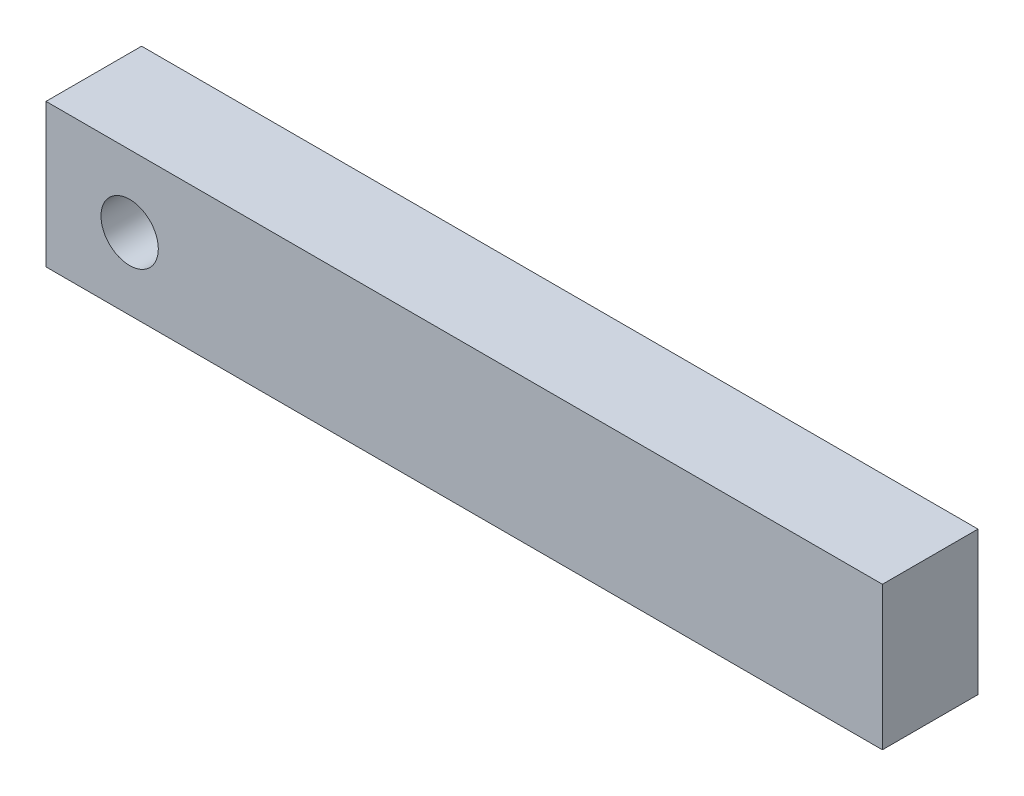
ISO-10303-21;
HEADER;
FILE_DESCRIPTION(('STEP AP214'),'2;1');
FILE_NAME('part.step','',(''),(''),'','','');
FILE_SCHEMA(('AUTOMOTIVE_DESIGN { 1 0 10303 214 1 1 1 1 }'));
ENDSEC;
DATA;
#1=APPLICATION_CONTEXT('core data for automotive mechanical design processes');
#2=APPLICATION_PROTOCOL_DEFINITION('international standard','automotive_design',2000,#1);
#3=PRODUCT_CONTEXT('',#1,'mechanical');
#4=PRODUCT('Part','Part','',(#3));
#5=PRODUCT_RELATED_PRODUCT_CATEGORY('part','',(#4));
#6=PRODUCT_DEFINITION_FORMATION('','',#4);
#7=PRODUCT_DEFINITION_CONTEXT('part definition',#1,'design');
#8=PRODUCT_DEFINITION('design','',#6,#7);
#9=PRODUCT_DEFINITION_SHAPE('','',#8);
#10=(LENGTH_UNIT() NAMED_UNIT(*) SI_UNIT(.MILLI.,.METRE.));
#11=(NAMED_UNIT(*) PLANE_ANGLE_UNIT() SI_UNIT($,.RADIAN.));
#12=(NAMED_UNIT(*) SI_UNIT($,.STERADIAN.) SOLID_ANGLE_UNIT());
#13=UNCERTAINTY_MEASURE_WITH_UNIT(LENGTH_MEASURE(1.E-05),#10,'distance_accuracy_value','');
#14=(GEOMETRIC_REPRESENTATION_CONTEXT(3) GLOBAL_UNCERTAINTY_ASSIGNED_CONTEXT((#13)) GLOBAL_UNIT_ASSIGNED_CONTEXT((#10,
#11,#12)) REPRESENTATION_CONTEXT('',''));
#15=CARTESIAN_POINT('',(0.,0.,0.));
#16=DIRECTION('',(0.,0.,1.));
#17=DIRECTION('',(1.,0.,0.));
#18=AXIS2_PLACEMENT_3D('',#15,#16,#17);
#19=CARTESIAN_POINT('',(-175.,30.,40.));
#20=DIRECTION('',(1.,0.,0.));
#21=DIRECTION('',(0.,0.,-1.));
#22=AXIS2_PLACEMENT_3D('',#19,#20,#21);
#23=PLANE('',#22);
#24=DIRECTION('',(0.,-1.,0.));
#25=VECTOR('',#24,1.);
#26=CARTESIAN_POINT('',(-175.,30.,0.));
#27=LINE('',#26,#25);
#28=CARTESIAN_POINT('',(-175.,30.,0.));
#29=VERTEX_POINT('',#28);
#30=CARTESIAN_POINT('',(-175.,-30.,0.));
#31=VERTEX_POINT('',#30);
#32=EDGE_CURVE('E104',#29,#31,#27,.T.);
#33=ORIENTED_EDGE('',*,*,#32,.T.);
#34=DIRECTION('',(0.,0.,-1.));
#35=VECTOR('',#34,1.);
#36=CARTESIAN_POINT('',(-175.,-30.,40.));
#37=LINE('',#36,#35);
#38=CARTESIAN_POINT('',(-175.,-30.,40.));
#39=VERTEX_POINT('',#38);
#40=EDGE_CURVE('E11',#39,#31,#37,.T.);
#41=ORIENTED_EDGE('',*,*,#40,.F.);
#42=DIRECTION('',(0.,-1.,0.));
#43=VECTOR('',#42,1.);
#44=CARTESIAN_POINT('',(-175.,30.,40.));
#45=LINE('',#44,#43);
#46=CARTESIAN_POINT('',(-175.,30.,40.));
#47=VERTEX_POINT('',#46);
#48=EDGE_CURVE('E92',#47,#39,#45,.T.);
#49=ORIENTED_EDGE('',*,*,#48,.F.);
#50=DIRECTION('',(0.,0.,-1.));
#51=VECTOR('',#50,1.);
#52=CARTESIAN_POINT('',(-175.,30.,40.));
#53=LINE('',#52,#51);
#54=EDGE_CURVE('E100',#47,#29,#53,.T.);
#55=ORIENTED_EDGE('',*,*,#54,.T.);
#56=EDGE_LOOP('',(#33,#41,#49,#55));
#57=FACE_BOUND('',#56,.T.);
#58=ADVANCED_FACE('F41',(#57),#23,.F.);
#59=CARTESIAN_POINT('',(-175.,-30.,40.));
#60=DIRECTION('',(0.,1.,0.));
#61=DIRECTION('',(0.,0.,1.));
#62=AXIS2_PLACEMENT_3D('',#59,#60,#61);
#63=PLANE('',#62);
#64=DIRECTION('',(1.,0.,0.));
#65=VECTOR('',#64,1.);
#66=CARTESIAN_POINT('',(-175.,-30.,0.));
#67=LINE('',#66,#65);
#68=CARTESIAN_POINT('',(175.,-30.,0.));
#69=VERTEX_POINT('',#68);
#70=EDGE_CURVE('E96',#31,#69,#67,.T.);
#71=ORIENTED_EDGE('',*,*,#70,.T.);
#72=DIRECTION('',(0.,0.,-1.));
#73=VECTOR('',#72,1.);
#74=CARTESIAN_POINT('',(175.,-30.,40.));
#75=LINE('',#74,#73);
#76=CARTESIAN_POINT('',(175.,-30.,40.));
#77=VERTEX_POINT('',#76);
#78=EDGE_CURVE('E49',#77,#69,#75,.T.);
#79=ORIENTED_EDGE('',*,*,#78,.F.);
#80=DIRECTION('',(1.,0.,0.));
#81=VECTOR('',#80,1.);
#82=CARTESIAN_POINT('',(-175.,-30.,40.));
#83=LINE('',#82,#81);
#84=EDGE_CURVE('E87',#39,#77,#83,.T.);
#85=ORIENTED_EDGE('',*,*,#84,.F.);
#86=ORIENTED_EDGE('',*,*,#40,.T.);
#87=EDGE_LOOP('',(#71,#79,#85,#86));
#88=FACE_BOUND('',#87,.T.);
#89=ADVANCED_FACE('F95',(#88),#63,.F.);
#90=CARTESIAN_POINT('',(175.,30.,40.));
#91=DIRECTION('',(-1.,0.,0.));
#92=DIRECTION('',(0.,0.,1.));
#93=AXIS2_PLACEMENT_3D('',#90,#91,#92);
#94=PLANE('',#93);
#95=DIRECTION('',(0.,1.,0.));
#96=VECTOR('',#95,1.);
#97=CARTESIAN_POINT('',(175.,30.,0.));
#98=LINE('',#97,#96);
#99=CARTESIAN_POINT('',(175.,30.,0.));
#100=VERTEX_POINT('',#99);
#101=EDGE_CURVE('E74',#69,#100,#98,.T.);
#102=ORIENTED_EDGE('',*,*,#101,.T.);
#103=DIRECTION('',(0.,0.,-1.));
#104=VECTOR('',#103,1.);
#105=CARTESIAN_POINT('',(175.,30.,40.));
#106=LINE('',#105,#104);
#107=CARTESIAN_POINT('',(175.,30.,40.));
#108=VERTEX_POINT('',#107);
#109=EDGE_CURVE('E97',#108,#100,#106,.T.);
#110=ORIENTED_EDGE('',*,*,#109,.F.);
#111=DIRECTION('',(0.,1.,0.));
#112=VECTOR('',#111,1.);
#113=CARTESIAN_POINT('',(175.,30.,40.));
#114=LINE('',#113,#112);
#115=EDGE_CURVE('E90',#77,#108,#114,.T.);
#116=ORIENTED_EDGE('',*,*,#115,.F.);
#117=ORIENTED_EDGE('',*,*,#78,.T.);
#118=EDGE_LOOP('',(#102,#110,#116,#117));
#119=FACE_BOUND('',#118,.T.);
#120=ADVANCED_FACE('F98',(#119),#94,.F.);
#121=CARTESIAN_POINT('',(-175.,30.,40.));
#122=DIRECTION('',(0.,-1.,0.));
#123=DIRECTION('',(0.,0.,-1.));
#124=AXIS2_PLACEMENT_3D('',#121,#122,#123);
#125=PLANE('',#124);
#126=DIRECTION('',(-1.,0.,0.));
#127=VECTOR('',#126,1.);
#128=CARTESIAN_POINT('',(-175.,30.,0.));
#129=LINE('',#128,#127);
#130=EDGE_CURVE('E80',#100,#29,#129,.T.);
#131=ORIENTED_EDGE('',*,*,#130,.T.);
#132=ORIENTED_EDGE('',*,*,#54,.F.);
#133=DIRECTION('',(-1.,0.,0.));
#134=VECTOR('',#133,1.);
#135=CARTESIAN_POINT('',(-175.,30.,40.));
#136=LINE('',#135,#134);
#137=EDGE_CURVE('E57',#108,#47,#136,.T.);
#138=ORIENTED_EDGE('',*,*,#137,.F.);
#139=ORIENTED_EDGE('',*,*,#109,.T.);
#140=EDGE_LOOP('',(#131,#132,#138,#139));
#141=FACE_BOUND('',#140,.T.);
#142=ADVANCED_FACE('F112',(#141),#125,.F.);
#143=CARTESIAN_POINT('',(0.,0.,40.));
#144=DIRECTION('',(0.,0.,1.));
#145=DIRECTION('',(1.,0.,0.));
#146=AXIS2_PLACEMENT_3D('',#143,#144,#145);
#147=PLANE('',#146);
#148=CARTESIAN_POINT('',(-140.,0.,40.));
#149=DIRECTION('',(0.,0.,1.));
#150=DIRECTION('',(1.,0.,0.));
#151=AXIS2_PLACEMENT_3D('',#148,#149,#150);
#152=CIRCLE('',#151,12.);
#153=CARTESIAN_POINT('',(-128.,0.,40.));
#154=VERTEX_POINT('',#153);
#155=EDGE_CURVE('E118',#154,#154,#152,.T.);
#156=ORIENTED_EDGE('',*,*,#155,.F.);
#157=EDGE_LOOP('',(#156));
#158=FACE_BOUND('',#157,.T.);
#159=ORIENTED_EDGE('',*,*,#48,.T.);
#160=ORIENTED_EDGE('',*,*,#84,.T.);
#161=ORIENTED_EDGE('',*,*,#115,.T.);
#162=ORIENTED_EDGE('',*,*,#137,.T.);
#163=EDGE_LOOP('',(#159,#160,#161,#162));
#164=FACE_BOUND('',#163,.T.);
#165=ADVANCED_FACE('F88',(#158,#164),#147,.T.);
#166=CARTESIAN_POINT('',(0.,0.,0.));
#167=DIRECTION('',(0.,0.,1.));
#168=DIRECTION('',(1.,0.,0.));
#169=AXIS2_PLACEMENT_3D('',#166,#167,#168);
#170=PLANE('',#169);
#171=CARTESIAN_POINT('',(-140.,0.,0.));
#172=DIRECTION('',(0.,0.,1.));
#173=DIRECTION('',(1.,0.,0.));
#174=AXIS2_PLACEMENT_3D('',#171,#172,#173);
#175=CIRCLE('',#174,12.);
#176=CARTESIAN_POINT('',(-128.,0.,0.));
#177=VERTEX_POINT('',#176);
#178=EDGE_CURVE('E107',#177,#177,#175,.T.);
#179=ORIENTED_EDGE('',*,*,#178,.T.);
#180=EDGE_LOOP('',(#179));
#181=FACE_BOUND('',#180,.T.);
#182=ORIENTED_EDGE('',*,*,#32,.F.);
#183=ORIENTED_EDGE('',*,*,#130,.F.);
#184=ORIENTED_EDGE('',*,*,#101,.F.);
#185=ORIENTED_EDGE('',*,*,#70,.F.);
#186=EDGE_LOOP('',(#182,#183,#184,#185));
#187=FACE_BOUND('',#186,.T.);
#188=ADVANCED_FACE('F115',(#181,#187),#170,.F.);
#189=CARTESIAN_POINT('',(-140.,0.,0.));
#190=DIRECTION('',(0.,0.,1.));
#191=DIRECTION('',(1.,0.,0.));
#192=AXIS2_PLACEMENT_3D('',#189,#190,#191);
#193=CYLINDRICAL_SURFACE('',#192,12.);
#194=ORIENTED_EDGE('',*,*,#178,.F.);
#195=EDGE_LOOP('',(#194));
#196=FACE_BOUND('',#195,.T.);
#197=ORIENTED_EDGE('',*,*,#155,.T.);
#198=EDGE_LOOP('',(#197));
#199=FACE_BOUND('',#198,.T.);
#200=ADVANCED_FACE('F125',(#196,#199),#193,.F.);
#201=CLOSED_SHELL('',(#58,#89,#120,#142,#165,#188,#200));
#202=MANIFOLD_SOLID_BREP('B2',#201);
#203=ADVANCED_BREP_SHAPE_REPRESENTATION('',(#18,#202),#14);
#204=SHAPE_DEFINITION_REPRESENTATION(#9,#203);
ENDSEC;
END-ISO-10303-21;
